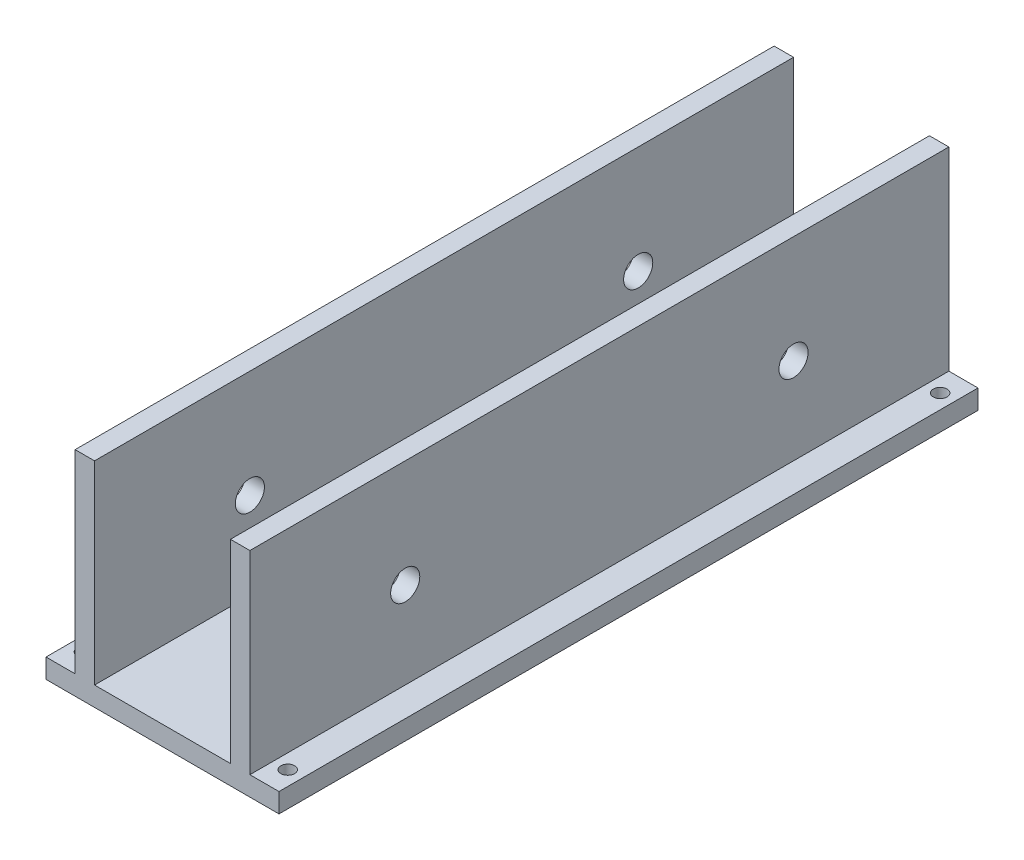
ISO-10303-21;
HEADER;
FILE_DESCRIPTION(('STEP AP214'),'2;1');
FILE_NAME('part.step','',(''),(''),'','','');
FILE_SCHEMA(('AUTOMOTIVE_DESIGN { 1 0 10303 214 1 1 1 1 }'));
ENDSEC;
DATA;
#1=APPLICATION_CONTEXT('core data for automotive mechanical design processes');
#2=APPLICATION_PROTOCOL_DEFINITION('international standard','automotive_design',2000,#1);
#3=PRODUCT_CONTEXT('',#1,'mechanical');
#4=PRODUCT('Part','Part','',(#3));
#5=PRODUCT_RELATED_PRODUCT_CATEGORY('part','',(#4));
#6=PRODUCT_DEFINITION_FORMATION('','',#4);
#7=PRODUCT_DEFINITION_CONTEXT('part definition',#1,'design');
#8=PRODUCT_DEFINITION('design','',#6,#7);
#9=PRODUCT_DEFINITION_SHAPE('','',#8);
#10=(LENGTH_UNIT() NAMED_UNIT(*) SI_UNIT(.MILLI.,.METRE.));
#11=(NAMED_UNIT(*) PLANE_ANGLE_UNIT() SI_UNIT($,.RADIAN.));
#12=(NAMED_UNIT(*) SI_UNIT($,.STERADIAN.) SOLID_ANGLE_UNIT());
#13=UNCERTAINTY_MEASURE_WITH_UNIT(LENGTH_MEASURE(1.E-05),#10,'distance_accuracy_value','');
#14=(GEOMETRIC_REPRESENTATION_CONTEXT(3) GLOBAL_UNCERTAINTY_ASSIGNED_CONTEXT((#13)) GLOBAL_UNIT_ASSIGNED_CONTEXT((#10,
#11,#12)) REPRESENTATION_CONTEXT('',''));
#15=CARTESIAN_POINT('',(0.,0.,0.));
#16=DIRECTION('',(0.,0.,1.));
#17=DIRECTION('',(1.,0.,0.));
#18=AXIS2_PLACEMENT_3D('',#15,#16,#17);
#19=CARTESIAN_POINT('',(0.,6.35,228.6));
#20=DIRECTION('',(1.,0.,0.));
#21=DIRECTION('',(0.,0.,-1.));
#22=AXIS2_PLACEMENT_3D('',#19,#20,#21);
#23=PLANE('',#22);
#24=DIRECTION('',(0.,-1.,0.));
#25=VECTOR('',#24,1.);
#26=CARTESIAN_POINT('',(0.,6.35,0.));
#27=LINE('',#26,#25);
#28=CARTESIAN_POINT('',(0.,6.35,0.));
#29=VERTEX_POINT('',#28);
#30=CARTESIAN_POINT('',(0.,0.,0.));
#31=VERTEX_POINT('',#30);
#32=EDGE_CURVE('E171',#29,#31,#27,.T.);
#33=ORIENTED_EDGE('',*,*,#32,.T.);
#34=DIRECTION('',(0.,0.,-1.));
#35=VECTOR('',#34,1.);
#36=CARTESIAN_POINT('',(0.,0.,228.6));
#37=LINE('',#36,#35);
#38=CARTESIAN_POINT('',(0.,0.,228.6));
#39=VERTEX_POINT('',#38);
#40=EDGE_CURVE('E11',#39,#31,#37,.T.);
#41=ORIENTED_EDGE('',*,*,#40,.F.);
#42=DIRECTION('',(0.,-1.,0.));
#43=VECTOR('',#42,1.);
#44=CARTESIAN_POINT('',(0.,6.35,228.6));
#45=LINE('',#44,#43);
#46=CARTESIAN_POINT('',(0.,6.35,228.6));
#47=VERTEX_POINT('',#46);
#48=EDGE_CURVE('E210',#47,#39,#45,.T.);
#49=ORIENTED_EDGE('',*,*,#48,.F.);
#50=DIRECTION('',(0.,0.,-1.));
#51=VECTOR('',#50,1.);
#52=CARTESIAN_POINT('',(0.,6.35,228.6));
#53=LINE('',#52,#51);
#54=EDGE_CURVE('E169',#47,#29,#53,.T.);
#55=ORIENTED_EDGE('',*,*,#54,.T.);
#56=EDGE_LOOP('',(#33,#41,#49,#55));
#57=FACE_BOUND('',#56,.T.);
#58=ADVANCED_FACE('F44',(#57),#23,.F.);
#59=CARTESIAN_POINT('',(0.,0.,228.6));
#60=DIRECTION('',(0.,1.,0.));
#61=DIRECTION('',(0.,0.,1.));
#62=AXIS2_PLACEMENT_3D('',#59,#60,#61);
#63=PLANE('',#62);
#64=CARTESIAN_POINT('',(71.4375,0.,7.62));
#65=DIRECTION('',(0.,1.,0.));
#66=DIRECTION('',(1.,0.,0.));
#67=AXIS2_PLACEMENT_3D('',#64,#65,#66);
#68=CIRCLE('',#67,2.24789999999999);
#69=CARTESIAN_POINT('',(73.6854,0.,7.62));
#70=VERTEX_POINT('',#69);
#71=EDGE_CURVE('E275',#70,#70,#68,.T.);
#72=ORIENTED_EDGE('',*,*,#71,.T.);
#73=EDGE_LOOP('',(#72));
#74=FACE_BOUND('',#73,.T.);
#75=CARTESIAN_POINT('',(71.4375,0.,220.98));
#76=DIRECTION('',(0.,1.,0.));
#77=DIRECTION('',(1.,0.,0.));
#78=AXIS2_PLACEMENT_3D('',#75,#76,#77);
#79=CIRCLE('',#78,2.24789999999999);
#80=CARTESIAN_POINT('',(73.6854,0.,220.98));
#81=VERTEX_POINT('',#80);
#82=EDGE_CURVE('E286',#81,#81,#79,.T.);
#83=ORIENTED_EDGE('',*,*,#82,.T.);
#84=EDGE_LOOP('',(#83));
#85=FACE_BOUND('',#84,.T.);
#86=CARTESIAN_POINT('',(4.76250000000004,0.,220.98));
#87=DIRECTION('',(0.,1.,0.));
#88=DIRECTION('',(-1.,0.,0.));
#89=AXIS2_PLACEMENT_3D('',#86,#87,#88);
#90=CIRCLE('',#89,2.24789999999999);
#91=CARTESIAN_POINT('',(2.51460000000004,0.,220.98));
#92=VERTEX_POINT('',#91);
#93=EDGE_CURVE('E279',#92,#92,#90,.T.);
#94=ORIENTED_EDGE('',*,*,#93,.T.);
#95=EDGE_LOOP('',(#94));
#96=FACE_BOUND('',#95,.T.);
#97=CARTESIAN_POINT('',(4.7625,0.,7.62));
#98=DIRECTION('',(0.,1.,0.));
#99=DIRECTION('',(-1.,0.,0.));
#100=AXIS2_PLACEMENT_3D('',#97,#98,#99);
#101=CIRCLE('',#100,2.2479);
#102=CARTESIAN_POINT('',(2.5146,0.,7.62));
#103=VERTEX_POINT('',#102);
#104=EDGE_CURVE('E180',#103,#103,#101,.T.);
#105=ORIENTED_EDGE('',*,*,#104,.T.);
#106=EDGE_LOOP('',(#105));
#107=FACE_BOUND('',#106,.T.);
#108=DIRECTION('',(1.,0.,0.));
#109=VECTOR('',#108,1.);
#110=CARTESIAN_POINT('',(0.,0.,0.));
#111=LINE('',#110,#109);
#112=CARTESIAN_POINT('',(76.2,0.,0.));
#113=VERTEX_POINT('',#112);
#114=EDGE_CURVE('E176',#31,#113,#111,.T.);
#115=ORIENTED_EDGE('',*,*,#114,.T.);
#116=DIRECTION('',(0.,0.,-1.));
#117=VECTOR('',#116,1.);
#118=CARTESIAN_POINT('',(76.2,0.,228.6));
#119=LINE('',#118,#117);
#120=CARTESIAN_POINT('',(76.2,0.,228.6));
#121=VERTEX_POINT('',#120);
#122=EDGE_CURVE('E54',#121,#113,#119,.T.);
#123=ORIENTED_EDGE('',*,*,#122,.F.);
#124=DIRECTION('',(1.,0.,0.));
#125=VECTOR('',#124,1.);
#126=CARTESIAN_POINT('',(0.,0.,228.6));
#127=LINE('',#126,#125);
#128=EDGE_CURVE('E118',#39,#121,#127,.T.);
#129=ORIENTED_EDGE('',*,*,#128,.F.);
#130=ORIENTED_EDGE('',*,*,#40,.T.);
#131=EDGE_LOOP('',(#115,#123,#129,#130));
#132=FACE_BOUND('',#131,.T.);
#133=ADVANCED_FACE('F375',(#74,#85,#96,#107,#132),#63,.F.);
#134=CARTESIAN_POINT('',(76.2,0.,228.6));
#135=DIRECTION('',(-1.,0.,0.));
#136=DIRECTION('',(0.,0.,1.));
#137=AXIS2_PLACEMENT_3D('',#134,#135,#136);
#138=PLANE('',#137);
#139=DIRECTION('',(0.,1.,0.));
#140=VECTOR('',#139,1.);
#141=CARTESIAN_POINT('',(76.2,0.,0.));
#142=LINE('',#141,#140);
#143=CARTESIAN_POINT('',(76.2,6.35000000000001,0.));
#144=VERTEX_POINT('',#143);
#145=EDGE_CURVE('E179',#113,#144,#142,.T.);
#146=ORIENTED_EDGE('',*,*,#145,.T.);
#147=DIRECTION('',(0.,0.,-1.));
#148=VECTOR('',#147,1.);
#149=CARTESIAN_POINT('',(76.2,6.35000000000001,228.6));
#150=LINE('',#149,#148);
#151=CARTESIAN_POINT('',(76.2,6.35000000000001,228.6));
#152=VERTEX_POINT('',#151);
#153=EDGE_CURVE('E233',#152,#144,#150,.T.);
#154=ORIENTED_EDGE('',*,*,#153,.F.);
#155=DIRECTION('',(0.,1.,0.));
#156=VECTOR('',#155,1.);
#157=CARTESIAN_POINT('',(76.2,0.,228.6));
#158=LINE('',#157,#156);
#159=EDGE_CURVE('E307',#121,#152,#158,.T.);
#160=ORIENTED_EDGE('',*,*,#159,.F.);
#161=ORIENTED_EDGE('',*,*,#122,.T.);
#162=EDGE_LOOP('',(#146,#154,#160,#161));
#163=FACE_BOUND('',#162,.T.);
#164=ADVANCED_FACE('F380',(#163),#138,.F.);
#165=CARTESIAN_POINT('',(76.2,6.35000000000001,228.6));
#166=DIRECTION('',(0.,-1.,0.));
#167=DIRECTION('',(1.,0.,0.));
#168=AXIS2_PLACEMENT_3D('',#165,#166,#167);
#169=PLANE('',#168);
#170=CARTESIAN_POINT('',(71.4375,6.35000000000003,7.62));
#171=DIRECTION('',(0.,1.,0.));
#172=DIRECTION('',(1.,0.,0.));
#173=AXIS2_PLACEMENT_3D('',#170,#171,#172);
#174=CIRCLE('',#173,2.24789999999999);
#175=CARTESIAN_POINT('',(73.6854,6.35000000000003,7.62));
#176=VERTEX_POINT('',#175);
#177=EDGE_CURVE('E289',#176,#176,#174,.T.);
#178=ORIENTED_EDGE('',*,*,#177,.F.);
#179=EDGE_LOOP('',(#178));
#180=FACE_BOUND('',#179,.T.);
#181=CARTESIAN_POINT('',(71.4375,6.35000000000003,220.98));
#182=DIRECTION('',(0.,1.,0.));
#183=DIRECTION('',(1.,0.,0.));
#184=AXIS2_PLACEMENT_3D('',#181,#182,#183);
#185=CIRCLE('',#184,2.24789999999999);
#186=CARTESIAN_POINT('',(73.6854,6.35000000000003,220.98));
#187=VERTEX_POINT('',#186);
#188=EDGE_CURVE('E281',#187,#187,#185,.T.);
#189=ORIENTED_EDGE('',*,*,#188,.F.);
#190=EDGE_LOOP('',(#189));
#191=FACE_BOUND('',#190,.T.);
#192=DIRECTION('',(-1.,0.,0.));
#193=VECTOR('',#192,1.);
#194=CARTESIAN_POINT('',(76.2,6.35000000000001,0.));
#195=LINE('',#194,#193);
#196=CARTESIAN_POINT('',(66.675,6.35,0.));
#197=VERTEX_POINT('',#196);
#198=EDGE_CURVE('E181',#144,#197,#195,.T.);
#199=ORIENTED_EDGE('',*,*,#198,.T.);
#200=DIRECTION('',(0.,0.,-1.));
#201=VECTOR('',#200,1.);
#202=CARTESIAN_POINT('',(66.675,6.35,228.6));
#203=LINE('',#202,#201);
#204=CARTESIAN_POINT('',(66.675,6.35,228.6));
#205=VERTEX_POINT('',#204);
#206=EDGE_CURVE('E227',#205,#197,#203,.T.);
#207=ORIENTED_EDGE('',*,*,#206,.F.);
#208=DIRECTION('',(-1.,0.,0.));
#209=VECTOR('',#208,1.);
#210=CARTESIAN_POINT('',(76.2,6.35000000000001,228.6));
#211=LINE('',#210,#209);
#212=EDGE_CURVE('E309',#152,#205,#211,.T.);
#213=ORIENTED_EDGE('',*,*,#212,.F.);
#214=ORIENTED_EDGE('',*,*,#153,.T.);
#215=EDGE_LOOP('',(#199,#207,#213,#214));
#216=FACE_BOUND('',#215,.T.);
#217=ADVANCED_FACE('F385',(#180,#191,#216),#169,.F.);
#218=CARTESIAN_POINT('',(66.675,6.35,228.6));
#219=DIRECTION('',(-1.,0.,0.));
#220=DIRECTION('',(0.,0.,1.));
#221=AXIS2_PLACEMENT_3D('',#218,#219,#220);
#222=PLANE('',#221);
#223=CARTESIAN_POINT('',(66.675,34.6769089187632,177.8));
#224=DIRECTION('',(1.,0.,0.));
#225=DIRECTION('',(0.,0.,-1.));
#226=AXIS2_PLACEMENT_3D('',#223,#224,#225);
#227=CIRCLE('',#226,4.76250000000001);
#228=CARTESIAN_POINT('',(66.675,34.6769089187632,173.0375));
#229=VERTEX_POINT('',#228);
#230=EDGE_CURVE('E243',#229,#229,#227,.T.);
#231=ORIENTED_EDGE('',*,*,#230,.F.);
#232=EDGE_LOOP('',(#231));
#233=FACE_BOUND('',#232,.T.);
#234=CARTESIAN_POINT('',(66.675,34.6769089187632,50.8));
#235=DIRECTION('',(1.,0.,0.));
#236=DIRECTION('',(0.,0.,-1.));
#237=AXIS2_PLACEMENT_3D('',#234,#235,#236);
#238=CIRCLE('',#237,4.7625);
#239=CARTESIAN_POINT('',(66.675,34.6769089187632,46.0375));
#240=VERTEX_POINT('',#239);
#241=EDGE_CURVE('E251',#240,#240,#238,.T.);
#242=ORIENTED_EDGE('',*,*,#241,.F.);
#243=EDGE_LOOP('',(#242));
#244=FACE_BOUND('',#243,.T.);
#245=DIRECTION('',(0.,1.,0.));
#246=VECTOR('',#245,1.);
#247=CARTESIAN_POINT('',(66.675,6.35,0.));
#248=LINE('',#247,#246);
#249=CARTESIAN_POINT('',(66.675,69.85,0.));
#250=VERTEX_POINT('',#249);
#251=EDGE_CURVE('E189',#197,#250,#248,.T.);
#252=ORIENTED_EDGE('',*,*,#251,.T.);
#253=DIRECTION('',(0.,0.,-1.));
#254=VECTOR('',#253,1.);
#255=CARTESIAN_POINT('',(66.675,69.85,228.6));
#256=LINE('',#255,#254);
#257=CARTESIAN_POINT('',(66.675,69.85,228.6));
#258=VERTEX_POINT('',#257);
#259=EDGE_CURVE('E229',#258,#250,#256,.T.);
#260=ORIENTED_EDGE('',*,*,#259,.F.);
#261=DIRECTION('',(0.,1.,0.));
#262=VECTOR('',#261,1.);
#263=CARTESIAN_POINT('',(66.675,6.35,228.6));
#264=LINE('',#263,#262);
#265=EDGE_CURVE('E311',#205,#258,#264,.T.);
#266=ORIENTED_EDGE('',*,*,#265,.F.);
#267=ORIENTED_EDGE('',*,*,#206,.T.);
#268=EDGE_LOOP('',(#252,#260,#266,#267));
#269=FACE_BOUND('',#268,.T.);
#270=ADVANCED_FACE('F389',(#233,#244,#269),#222,.F.);
#271=CARTESIAN_POINT('',(66.675,69.85,228.6));
#272=DIRECTION('',(0.,-1.,0.));
#273=DIRECTION('',(0.,0.,-1.));
#274=AXIS2_PLACEMENT_3D('',#271,#272,#273);
#275=PLANE('',#274);
#276=DIRECTION('',(-1.,0.,0.));
#277=VECTOR('',#276,1.);
#278=CARTESIAN_POINT('',(66.675,69.85,0.));
#279=LINE('',#278,#277);
#280=CARTESIAN_POINT('',(60.325,69.85,0.));
#281=VERTEX_POINT('',#280);
#282=EDGE_CURVE('E188',#250,#281,#279,.T.);
#283=ORIENTED_EDGE('',*,*,#282,.T.);
#284=DIRECTION('',(0.,0.,-1.));
#285=VECTOR('',#284,1.);
#286=CARTESIAN_POINT('',(60.325,69.85,228.6));
#287=LINE('',#286,#285);
#288=CARTESIAN_POINT('',(60.325,69.85,228.6));
#289=VERTEX_POINT('',#288);
#290=EDGE_CURVE('E225',#289,#281,#287,.T.);
#291=ORIENTED_EDGE('',*,*,#290,.F.);
#292=DIRECTION('',(-1.,0.,0.));
#293=VECTOR('',#292,1.);
#294=CARTESIAN_POINT('',(66.675,69.85,228.6));
#295=LINE('',#294,#293);
#296=EDGE_CURVE('E316',#258,#289,#295,.T.);
#297=ORIENTED_EDGE('',*,*,#296,.F.);
#298=ORIENTED_EDGE('',*,*,#259,.T.);
#299=EDGE_LOOP('',(#283,#291,#297,#298));
#300=FACE_BOUND('',#299,.T.);
#301=ADVANCED_FACE('F391',(#300),#275,.F.);
#302=CARTESIAN_POINT('',(60.325,69.85,228.6));
#303=DIRECTION('',(1.,0.,0.));
#304=DIRECTION('',(0.,0.,-1.));
#305=AXIS2_PLACEMENT_3D('',#302,#303,#304);
#306=PLANE('',#305);
#307=CARTESIAN_POINT('',(60.325,34.6769089187632,177.8));
#308=DIRECTION('',(1.,0.,0.));
#309=DIRECTION('',(0.,0.,-1.));
#310=AXIS2_PLACEMENT_3D('',#307,#308,#309);
#311=CIRCLE('',#310,4.76250000000001);
#312=CARTESIAN_POINT('',(60.325,34.6769089187632,173.0375));
#313=VERTEX_POINT('',#312);
#314=EDGE_CURVE('E268',#313,#313,#311,.T.);
#315=ORIENTED_EDGE('',*,*,#314,.T.);
#316=EDGE_LOOP('',(#315));
#317=FACE_BOUND('',#316,.T.);
#318=CARTESIAN_POINT('',(60.325,34.6769089187632,50.8));
#319=DIRECTION('',(1.,0.,0.));
#320=DIRECTION('',(0.,0.,-1.));
#321=AXIS2_PLACEMENT_3D('',#318,#319,#320);
#322=CIRCLE('',#321,4.7625);
#323=CARTESIAN_POINT('',(60.325,34.6769089187632,46.0375));
#324=VERTEX_POINT('',#323);
#325=EDGE_CURVE('E249',#324,#324,#322,.T.);
#326=ORIENTED_EDGE('',*,*,#325,.T.);
#327=EDGE_LOOP('',(#326));
#328=FACE_BOUND('',#327,.T.);
#329=DIRECTION('',(0.,-1.,0.));
#330=VECTOR('',#329,1.);
#331=CARTESIAN_POINT('',(60.325,69.85,0.));
#332=LINE('',#331,#330);
#333=CARTESIAN_POINT('',(60.325,6.35,0.));
#334=VERTEX_POINT('',#333);
#335=EDGE_CURVE('E195',#281,#334,#332,.T.);
#336=ORIENTED_EDGE('',*,*,#335,.T.);
#337=DIRECTION('',(0.,0.,-1.));
#338=VECTOR('',#337,1.);
#339=CARTESIAN_POINT('',(60.325,6.35,228.6));
#340=LINE('',#339,#338);
#341=CARTESIAN_POINT('',(60.325,6.35,228.6));
#342=VERTEX_POINT('',#341);
#343=EDGE_CURVE('E217',#342,#334,#340,.T.);
#344=ORIENTED_EDGE('',*,*,#343,.F.);
#345=DIRECTION('',(0.,-1.,0.));
#346=VECTOR('',#345,1.);
#347=CARTESIAN_POINT('',(60.325,69.85,228.6));
#348=LINE('',#347,#346);
#349=EDGE_CURVE('E317',#289,#342,#348,.T.);
#350=ORIENTED_EDGE('',*,*,#349,.F.);
#351=ORIENTED_EDGE('',*,*,#290,.T.);
#352=EDGE_LOOP('',(#336,#344,#350,#351));
#353=FACE_BOUND('',#352,.T.);
#354=ADVANCED_FACE('F396',(#317,#328,#353),#306,.F.);
#355=CARTESIAN_POINT('',(60.325,6.35,228.6));
#356=DIRECTION('',(0.,-1.,0.));
#357=DIRECTION('',(0.,0.,-1.));
#358=AXIS2_PLACEMENT_3D('',#355,#356,#357);
#359=PLANE('',#358);
#360=DIRECTION('',(-1.,0.,0.));
#361=VECTOR('',#360,1.);
#362=CARTESIAN_POINT('',(60.325,6.35,0.));
#363=LINE('',#362,#361);
#364=CARTESIAN_POINT('',(15.875,6.35,0.));
#365=VERTEX_POINT('',#364);
#366=EDGE_CURVE('E194',#334,#365,#363,.T.);
#367=ORIENTED_EDGE('',*,*,#366,.T.);
#368=DIRECTION('',(0.,0.,-1.));
#369=VECTOR('',#368,1.);
#370=CARTESIAN_POINT('',(15.875,6.35,228.6));
#371=LINE('',#370,#369);
#372=CARTESIAN_POINT('',(15.875,6.35,228.6));
#373=VERTEX_POINT('',#372);
#374=EDGE_CURVE('E212',#373,#365,#371,.T.);
#375=ORIENTED_EDGE('',*,*,#374,.F.);
#376=DIRECTION('',(-1.,0.,0.));
#377=VECTOR('',#376,1.);
#378=CARTESIAN_POINT('',(60.325,6.35,228.6));
#379=LINE('',#378,#377);
#380=EDGE_CURVE('E325',#342,#373,#379,.T.);
#381=ORIENTED_EDGE('',*,*,#380,.F.);
#382=ORIENTED_EDGE('',*,*,#343,.T.);
#383=EDGE_LOOP('',(#367,#375,#381,#382));
#384=FACE_BOUND('',#383,.T.);
#385=ADVANCED_FACE('F345',(#384),#359,.F.);
#386=CARTESIAN_POINT('',(15.875,6.35,228.6));
#387=DIRECTION('',(-1.,0.,0.));
#388=DIRECTION('',(0.,-1.,0.));
#389=AXIS2_PLACEMENT_3D('',#386,#387,#388);
#390=PLANE('',#389);
#391=CARTESIAN_POINT('',(15.875,34.6769089187632,177.8));
#392=DIRECTION('',(-1.,0.,0.));
#393=DIRECTION('',(0.,-1.,0.));
#394=AXIS2_PLACEMENT_3D('',#391,#392,#393);
#395=CIRCLE('',#394,4.76250000000001);
#396=CARTESIAN_POINT('',(15.875,29.9144089187632,177.8));
#397=VERTEX_POINT('',#396);
#398=EDGE_CURVE('E262',#397,#397,#395,.T.);
#399=ORIENTED_EDGE('',*,*,#398,.T.);
#400=EDGE_LOOP('',(#399));
#401=FACE_BOUND('',#400,.T.);
#402=CARTESIAN_POINT('',(15.875,34.6769089187632,50.8));
#403=DIRECTION('',(-1.,0.,0.));
#404=DIRECTION('',(0.,-1.,0.));
#405=AXIS2_PLACEMENT_3D('',#402,#403,#404);
#406=CIRCLE('',#405,4.7625);
#407=CARTESIAN_POINT('',(15.875,29.9144089187632,50.8));
#408=VERTEX_POINT('',#407);
#409=EDGE_CURVE('E245',#408,#408,#406,.T.);
#410=ORIENTED_EDGE('',*,*,#409,.T.);
#411=EDGE_LOOP('',(#410));
#412=FACE_BOUND('',#411,.T.);
#413=DIRECTION('',(0.,1.,0.));
#414=VECTOR('',#413,1.);
#415=CARTESIAN_POINT('',(15.875,6.35,0.));
#416=LINE('',#415,#414);
#417=CARTESIAN_POINT('',(15.875,69.85,0.));
#418=VERTEX_POINT('',#417);
#419=EDGE_CURVE('E196',#365,#418,#416,.T.);
#420=ORIENTED_EDGE('',*,*,#419,.T.);
#421=DIRECTION('',(0.,0.,-1.));
#422=VECTOR('',#421,1.);
#423=CARTESIAN_POINT('',(15.875,69.85,228.6));
#424=LINE('',#423,#422);
#425=CARTESIAN_POINT('',(15.875,69.85,228.6));
#426=VERTEX_POINT('',#425);
#427=EDGE_CURVE('E161',#426,#418,#424,.T.);
#428=ORIENTED_EDGE('',*,*,#427,.F.);
#429=DIRECTION('',(0.,1.,0.));
#430=VECTOR('',#429,1.);
#431=CARTESIAN_POINT('',(15.875,6.35,228.6));
#432=LINE('',#431,#430);
#433=EDGE_CURVE('E147',#373,#426,#432,.T.);
#434=ORIENTED_EDGE('',*,*,#433,.F.);
#435=ORIENTED_EDGE('',*,*,#374,.T.);
#436=EDGE_LOOP('',(#420,#428,#434,#435));
#437=FACE_BOUND('',#436,.T.);
#438=ADVANCED_FACE('F338',(#401,#412,#437),#390,.F.);
#439=CARTESIAN_POINT('',(15.875,69.85,228.6));
#440=DIRECTION('',(0.,-1.,0.));
#441=DIRECTION('',(0.,0.,-1.));
#442=AXIS2_PLACEMENT_3D('',#439,#440,#441);
#443=PLANE('',#442);
#444=DIRECTION('',(-1.,0.,0.));
#445=VECTOR('',#444,1.);
#446=CARTESIAN_POINT('',(15.875,69.85,0.));
#447=LINE('',#446,#445);
#448=CARTESIAN_POINT('',(9.52499999999999,69.85,0.));
#449=VERTEX_POINT('',#448);
#450=EDGE_CURVE('E157',#418,#449,#447,.T.);
#451=ORIENTED_EDGE('',*,*,#450,.T.);
#452=DIRECTION('',(0.,0.,-1.));
#453=VECTOR('',#452,1.);
#454=CARTESIAN_POINT('',(9.52499999999999,69.85,228.6));
#455=LINE('',#454,#453);
#456=CARTESIAN_POINT('',(9.52499999999999,69.85,228.6));
#457=VERTEX_POINT('',#456);
#458=EDGE_CURVE('E156',#457,#449,#455,.T.);
#459=ORIENTED_EDGE('',*,*,#458,.F.);
#460=DIRECTION('',(-1.,0.,0.));
#461=VECTOR('',#460,1.);
#462=CARTESIAN_POINT('',(15.875,69.85,228.6));
#463=LINE('',#462,#461);
#464=EDGE_CURVE('E145',#426,#457,#463,.T.);
#465=ORIENTED_EDGE('',*,*,#464,.F.);
#466=ORIENTED_EDGE('',*,*,#427,.T.);
#467=EDGE_LOOP('',(#451,#459,#465,#466));
#468=FACE_BOUND('',#467,.T.);
#469=ADVANCED_FACE('F160',(#468),#443,.F.);
#470=CARTESIAN_POINT('',(9.52499999999999,69.85,228.6));
#471=DIRECTION('',(1.,0.,0.));
#472=DIRECTION('',(0.,1.,0.));
#473=AXIS2_PLACEMENT_3D('',#470,#471,#472);
#474=PLANE('',#473);
#475=CARTESIAN_POINT('',(9.525,34.6769089187632,177.8));
#476=DIRECTION('',(1.,0.,0.));
#477=DIRECTION('',(0.,1.,0.));
#478=AXIS2_PLACEMENT_3D('',#475,#476,#477);
#479=CIRCLE('',#478,4.76250000000001);
#480=CARTESIAN_POINT('',(9.525,39.4394089187632,177.8));
#481=VERTEX_POINT('',#480);
#482=EDGE_CURVE('E48',#481,#481,#479,.T.);
#483=ORIENTED_EDGE('',*,*,#482,.T.);
#484=EDGE_LOOP('',(#483));
#485=FACE_BOUND('',#484,.T.);
#486=CARTESIAN_POINT('',(9.525,34.6769089187632,50.8));
#487=DIRECTION('',(1.,0.,0.));
#488=DIRECTION('',(0.,1.,0.));
#489=AXIS2_PLACEMENT_3D('',#486,#487,#488);
#490=CIRCLE('',#489,4.7625);
#491=CARTESIAN_POINT('',(9.525,39.4394089187632,50.8));
#492=VERTEX_POINT('',#491);
#493=EDGE_CURVE('E238',#492,#492,#490,.T.);
#494=ORIENTED_EDGE('',*,*,#493,.T.);
#495=EDGE_LOOP('',(#494));
#496=FACE_BOUND('',#495,.T.);
#497=DIRECTION('',(0.,-1.,0.));
#498=VECTOR('',#497,1.);
#499=CARTESIAN_POINT('',(9.52499999999999,69.85,0.));
#500=LINE('',#499,#498);
#501=CARTESIAN_POINT('',(9.525,6.35,0.));
#502=VERTEX_POINT('',#501);
#503=EDGE_CURVE('E104',#449,#502,#500,.T.);
#504=ORIENTED_EDGE('',*,*,#503,.T.);
#505=DIRECTION('',(0.,0.,-1.));
#506=VECTOR('',#505,1.);
#507=CARTESIAN_POINT('',(9.525,6.35,228.6));
#508=LINE('',#507,#506);
#509=CARTESIAN_POINT('',(9.525,6.35,228.6));
#510=VERTEX_POINT('',#509);
#511=EDGE_CURVE('E165',#510,#502,#508,.T.);
#512=ORIENTED_EDGE('',*,*,#511,.F.);
#513=DIRECTION('',(0.,-1.,0.));
#514=VECTOR('',#513,1.);
#515=CARTESIAN_POINT('',(9.52499999999999,69.85,228.6));
#516=LINE('',#515,#514);
#517=EDGE_CURVE('E146',#457,#510,#516,.T.);
#518=ORIENTED_EDGE('',*,*,#517,.F.);
#519=ORIENTED_EDGE('',*,*,#458,.T.);
#520=EDGE_LOOP('',(#504,#512,#518,#519));
#521=FACE_BOUND('',#520,.T.);
#522=ADVANCED_FACE('F163',(#485,#496,#521),#474,.F.);
#523=CARTESIAN_POINT('',(9.525,6.35,228.6));
#524=DIRECTION('',(0.,-1.,0.));
#525=DIRECTION('',(1.,0.,0.));
#526=AXIS2_PLACEMENT_3D('',#523,#524,#525);
#527=PLANE('',#526);
#528=CARTESIAN_POINT('',(4.76250000000003,6.35,220.98));
#529=DIRECTION('',(0.,1.,0.));
#530=DIRECTION('',(-1.,0.,0.));
#531=AXIS2_PLACEMENT_3D('',#528,#529,#530);
#532=CIRCLE('',#531,2.24789999999999);
#533=CARTESIAN_POINT('',(2.51460000000004,6.35,220.98));
#534=VERTEX_POINT('',#533);
#535=EDGE_CURVE('E272',#534,#534,#532,.T.);
#536=ORIENTED_EDGE('',*,*,#535,.F.);
#537=EDGE_LOOP('',(#536));
#538=FACE_BOUND('',#537,.T.);
#539=CARTESIAN_POINT('',(4.76249999999999,6.35,7.62));
#540=DIRECTION('',(0.,1.,0.));
#541=DIRECTION('',(-1.,0.,0.));
#542=AXIS2_PLACEMENT_3D('',#539,#540,#541);
#543=CIRCLE('',#542,2.2479);
#544=CARTESIAN_POINT('',(2.51459999999999,6.35,7.62));
#545=VERTEX_POINT('',#544);
#546=EDGE_CURVE('E280',#545,#545,#543,.T.);
#547=ORIENTED_EDGE('',*,*,#546,.F.);
#548=EDGE_LOOP('',(#547));
#549=FACE_BOUND('',#548,.T.);
#550=DIRECTION('',(-1.,0.,0.));
#551=VECTOR('',#550,1.);
#552=CARTESIAN_POINT('',(9.525,6.35,0.));
#553=LINE('',#552,#551);
#554=EDGE_CURVE('E112',#502,#29,#553,.T.);
#555=ORIENTED_EDGE('',*,*,#554,.T.);
#556=ORIENTED_EDGE('',*,*,#54,.F.);
#557=DIRECTION('',(-1.,0.,0.));
#558=VECTOR('',#557,1.);
#559=CARTESIAN_POINT('',(9.525,6.35,228.6));
#560=LINE('',#559,#558);
#561=EDGE_CURVE('E63',#510,#47,#560,.T.);
#562=ORIENTED_EDGE('',*,*,#561,.F.);
#563=ORIENTED_EDGE('',*,*,#511,.T.);
#564=EDGE_LOOP('',(#555,#556,#562,#563));
#565=FACE_BOUND('',#564,.T.);
#566=ADVANCED_FACE('F356',(#538,#549,#565),#527,.F.);
#567=CARTESIAN_POINT('',(0.,0.,228.6));
#568=DIRECTION('',(0.,0.,1.));
#569=DIRECTION('',(1.,0.,0.));
#570=AXIS2_PLACEMENT_3D('',#567,#568,#569);
#571=PLANE('',#570);
#572=ORIENTED_EDGE('',*,*,#48,.T.);
#573=ORIENTED_EDGE('',*,*,#128,.T.);
#574=ORIENTED_EDGE('',*,*,#159,.T.);
#575=ORIENTED_EDGE('',*,*,#212,.T.);
#576=ORIENTED_EDGE('',*,*,#265,.T.);
#577=ORIENTED_EDGE('',*,*,#296,.T.);
#578=ORIENTED_EDGE('',*,*,#349,.T.);
#579=ORIENTED_EDGE('',*,*,#380,.T.);
#580=ORIENTED_EDGE('',*,*,#433,.T.);
#581=ORIENTED_EDGE('',*,*,#464,.T.);
#582=ORIENTED_EDGE('',*,*,#517,.T.);
#583=ORIENTED_EDGE('',*,*,#561,.T.);
#584=EDGE_LOOP('',(#572,#573,#574,#575,#576,#577,#578,#579,#580,#581,#582,#583));
#585=FACE_BOUND('',#584,.T.);
#586=ADVANCED_FACE('F148',(#585),#571,.T.);
#587=CARTESIAN_POINT('',(0.,0.,0.));
#588=DIRECTION('',(0.,0.,1.));
#589=DIRECTION('',(1.,0.,0.));
#590=AXIS2_PLACEMENT_3D('',#587,#588,#589);
#591=PLANE('',#590);
#592=ORIENTED_EDGE('',*,*,#32,.F.);
#593=ORIENTED_EDGE('',*,*,#554,.F.);
#594=ORIENTED_EDGE('',*,*,#503,.F.);
#595=ORIENTED_EDGE('',*,*,#450,.F.);
#596=ORIENTED_EDGE('',*,*,#419,.F.);
#597=ORIENTED_EDGE('',*,*,#366,.F.);
#598=ORIENTED_EDGE('',*,*,#335,.F.);
#599=ORIENTED_EDGE('',*,*,#282,.F.);
#600=ORIENTED_EDGE('',*,*,#251,.F.);
#601=ORIENTED_EDGE('',*,*,#198,.F.);
#602=ORIENTED_EDGE('',*,*,#145,.F.);
#603=ORIENTED_EDGE('',*,*,#114,.F.);
#604=EDGE_LOOP('',(#592,#593,#594,#595,#596,#597,#598,#599,#600,#601,#602,#603));
#605=FACE_BOUND('',#604,.T.);
#606=ADVANCED_FACE('F354',(#605),#591,.F.);
#607=CARTESIAN_POINT('',(4.7625,0.,7.62));
#608=DIRECTION('',(0.,1.,0.));
#609=DIRECTION('',(-1.,0.,0.));
#610=AXIS2_PLACEMENT_3D('',#607,#608,#609);
#611=CYLINDRICAL_SURFACE('',#610,2.2479);
#612=ORIENTED_EDGE('',*,*,#104,.F.);
#613=EDGE_LOOP('',(#612));
#614=FACE_BOUND('',#613,.T.);
#615=ORIENTED_EDGE('',*,*,#546,.T.);
#616=EDGE_LOOP('',(#615));
#617=FACE_BOUND('',#616,.T.);
#618=ADVANCED_FACE('F423',(#614,#617),#611,.F.);
#619=CARTESIAN_POINT('',(4.76250000000004,0.,220.98));
#620=DIRECTION('',(0.,1.,0.));
#621=DIRECTION('',(-1.,0.,0.));
#622=AXIS2_PLACEMENT_3D('',#619,#620,#621);
#623=CYLINDRICAL_SURFACE('',#622,2.24789999999999);
#624=ORIENTED_EDGE('',*,*,#93,.F.);
#625=EDGE_LOOP('',(#624));
#626=FACE_BOUND('',#625,.T.);
#627=ORIENTED_EDGE('',*,*,#535,.T.);
#628=EDGE_LOOP('',(#627));
#629=FACE_BOUND('',#628,.T.);
#630=ADVANCED_FACE('F431',(#626,#629),#623,.F.);
#631=CARTESIAN_POINT('',(71.4375,0.,220.98));
#632=DIRECTION('',(0.,1.,0.));
#633=DIRECTION('',(-1.,0.,0.));
#634=AXIS2_PLACEMENT_3D('',#631,#632,#633);
#635=CYLINDRICAL_SURFACE('',#634,2.24789999999999);
#636=ORIENTED_EDGE('',*,*,#82,.F.);
#637=EDGE_LOOP('',(#636));
#638=FACE_BOUND('',#637,.T.);
#639=ORIENTED_EDGE('',*,*,#188,.T.);
#640=EDGE_LOOP('',(#639));
#641=FACE_BOUND('',#640,.T.);
#642=ADVANCED_FACE('F442',(#638,#641),#635,.F.);
#643=CARTESIAN_POINT('',(71.4375,0.,7.62));
#644=DIRECTION('',(0.,1.,0.));
#645=DIRECTION('',(-1.,0.,0.));
#646=AXIS2_PLACEMENT_3D('',#643,#644,#645);
#647=CYLINDRICAL_SURFACE('',#646,2.24789999999999);
#648=ORIENTED_EDGE('',*,*,#71,.F.);
#649=EDGE_LOOP('',(#648));
#650=FACE_BOUND('',#649,.T.);
#651=ORIENTED_EDGE('',*,*,#177,.T.);
#652=EDGE_LOOP('',(#651));
#653=FACE_BOUND('',#652,.T.);
#654=ADVANCED_FACE('F451',(#650,#653),#647,.F.);
#655=CARTESIAN_POINT('',(0.,34.6769089187632,50.8));
#656=DIRECTION('',(1.,0.,0.));
#657=DIRECTION('',(0.,0.,-1.));
#658=AXIS2_PLACEMENT_3D('',#655,#656,#657);
#659=CYLINDRICAL_SURFACE('',#658,4.7625);
#660=ORIENTED_EDGE('',*,*,#493,.F.);
#661=EDGE_LOOP('',(#660));
#662=FACE_BOUND('',#661,.T.);
#663=ORIENTED_EDGE('',*,*,#409,.F.);
#664=EDGE_LOOP('',(#663));
#665=FACE_BOUND('',#664,.T.);
#666=ADVANCED_FACE('F331',(#662,#665),#659,.F.);
#667=CARTESIAN_POINT('',(0.,34.6769089187632,177.8));
#668=DIRECTION('',(1.,0.,0.));
#669=DIRECTION('',(0.,0.,-1.));
#670=AXIS2_PLACEMENT_3D('',#667,#668,#669);
#671=CYLINDRICAL_SURFACE('',#670,4.76250000000001);
#672=ORIENTED_EDGE('',*,*,#482,.F.);
#673=EDGE_LOOP('',(#672));
#674=FACE_BOUND('',#673,.T.);
#675=ORIENTED_EDGE('',*,*,#398,.F.);
#676=EDGE_LOOP('',(#675));
#677=FACE_BOUND('',#676,.T.);
#678=ADVANCED_FACE('F329',(#674,#677),#671,.F.);
#679=ORIENTED_EDGE('',*,*,#241,.T.);
#680=EDGE_LOOP('',(#679));
#681=FACE_BOUND('',#680,.T.);
#682=ORIENTED_EDGE('',*,*,#325,.F.);
#683=EDGE_LOOP('',(#682));
#684=FACE_BOUND('',#683,.T.);
#685=ADVANCED_FACE('F334',(#681,#684),#659,.F.);
#686=ORIENTED_EDGE('',*,*,#230,.T.);
#687=EDGE_LOOP('',(#686));
#688=FACE_BOUND('',#687,.T.);
#689=ORIENTED_EDGE('',*,*,#314,.F.);
#690=EDGE_LOOP('',(#689));
#691=FACE_BOUND('',#690,.T.);
#692=ADVANCED_FACE('F339',(#688,#691),#671,.F.);
#693=CLOSED_SHELL('',(#58,#133,#164,#217,#270,#301,#354,#385,#438,#469,#522,#566,#586,#606,#618,
#630,#642,#654,#666,#678,#685,#692));
#694=MANIFOLD_SOLID_BREP('B2',#693);
#695=ADVANCED_BREP_SHAPE_REPRESENTATION('',(#18,#694),#14);
#696=SHAPE_DEFINITION_REPRESENTATION(#9,#695);
ENDSEC;
END-ISO-10303-21;
